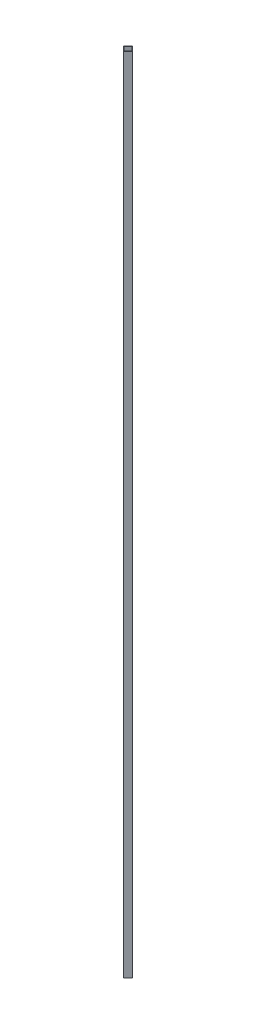
ISO-10303-21;
HEADER;
FILE_DESCRIPTION(('STEP AP214'),'2;1');
FILE_NAME('part.step','',(''),(''),'','','');
FILE_SCHEMA(('AUTOMOTIVE_DESIGN { 1 0 10303 214 1 1 1 1 }'));
ENDSEC;
DATA;
#1=APPLICATION_CONTEXT('core data for automotive mechanical design processes');
#2=APPLICATION_PROTOCOL_DEFINITION('international standard','automotive_design',2000,#1);
#3=PRODUCT_CONTEXT('',#1,'mechanical');
#4=PRODUCT('Part','Part','',(#3));
#5=PRODUCT_RELATED_PRODUCT_CATEGORY('part','',(#4));
#6=PRODUCT_DEFINITION_FORMATION('','',#4);
#7=PRODUCT_DEFINITION_CONTEXT('part definition',#1,'design');
#8=PRODUCT_DEFINITION('design','',#6,#7);
#9=PRODUCT_DEFINITION_SHAPE('','',#8);
#10=(LENGTH_UNIT() NAMED_UNIT(*) SI_UNIT(.MILLI.,.METRE.));
#11=(NAMED_UNIT(*) PLANE_ANGLE_UNIT() SI_UNIT($,.RADIAN.));
#12=(NAMED_UNIT(*) SI_UNIT($,.STERADIAN.) SOLID_ANGLE_UNIT());
#13=UNCERTAINTY_MEASURE_WITH_UNIT(LENGTH_MEASURE(1.E-05),#10,'distance_accuracy_value','');
#14=(GEOMETRIC_REPRESENTATION_CONTEXT(3) GLOBAL_UNCERTAINTY_ASSIGNED_CONTEXT((#13)) GLOBAL_UNIT_ASSIGNED_CONTEXT((#10,
#11,#12)) REPRESENTATION_CONTEXT('',''));
#15=CARTESIAN_POINT('',(0.,0.,0.));
#16=DIRECTION('',(0.,0.,1.));
#17=DIRECTION('',(1.,0.,0.));
#18=AXIS2_PLACEMENT_3D('',#15,#16,#17);
#19=CARTESIAN_POINT('',(-17.9605122421383,3048.,0.));
#20=DIRECTION('',(0.707106781186546,0.,-0.707106781186549));
#21=DIRECTION('',(-0.707106781186549,0.,-0.707106781186546));
#22=AXIS2_PLACEMENT_3D('',#19,#20,#21);
#23=PLANE('',#22);
#24=DIRECTION('',(0.707106781186549,0.,0.707106781186546));
#25=VECTOR('',#24,1.);
#26=CARTESIAN_POINT('',(-17.9605122421383,0.,0.));
#27=LINE('',#26,#25);
#28=CARTESIAN_POINT('',(-17.9605122421383,0.,0.));
#29=VERTEX_POINT('',#28);
#30=CARTESIAN_POINT('',(0.,0.,17.9605122421383));
#31=VERTEX_POINT('',#30);
#32=EDGE_CURVE('E160',#29,#31,#27,.T.);
#33=ORIENTED_EDGE('',*,*,#32,.T.);
#34=DIRECTION('',(0.,-1.,0.));
#35=VECTOR('',#34,1.);
#36=CARTESIAN_POINT('',(0.,3048.,17.9605122421383));
#37=LINE('',#36,#35);
#38=CARTESIAN_POINT('',(0.,3048.,17.9605122421383));
#39=VERTEX_POINT('',#38);
#40=EDGE_CURVE('E12',#39,#31,#37,.T.);
#41=ORIENTED_EDGE('',*,*,#40,.F.);
#42=DIRECTION('',(0.707106781186549,0.,0.707106781186546));
#43=VECTOR('',#42,1.);
#44=CARTESIAN_POINT('',(-17.9605122421383,3048.,0.));
#45=LINE('',#44,#43);
#46=CARTESIAN_POINT('',(-17.9605122421383,3048.,0.));
#47=VERTEX_POINT('',#46);
#48=EDGE_CURVE('E164',#47,#39,#45,.T.);
#49=ORIENTED_EDGE('',*,*,#48,.F.);
#50=DIRECTION('',(0.,-1.,0.));
#51=VECTOR('',#50,1.);
#52=CARTESIAN_POINT('',(-17.9605122421383,3048.,0.));
#53=LINE('',#52,#51);
#54=EDGE_CURVE('E176',#47,#29,#53,.T.);
#55=ORIENTED_EDGE('',*,*,#54,.T.);
#56=EDGE_LOOP('',(#33,#41,#49,#55));
#57=FACE_BOUND('',#56,.T.);
#58=ADVANCED_FACE('F65',(#57),#23,.F.);
#59=CARTESIAN_POINT('',(0.,3048.,17.9605122421383));
#60=DIRECTION('',(-0.707106781186549,0.,-0.707106781186546));
#61=DIRECTION('',(-0.707106781186546,0.,0.707106781186549));
#62=AXIS2_PLACEMENT_3D('',#59,#60,#61);
#63=PLANE('',#62);
#64=DIRECTION('',(0.707106781186546,0.,-0.707106781186549));
#65=VECTOR('',#64,1.);
#66=CARTESIAN_POINT('',(0.,0.,17.9605122421383));
#67=LINE('',#66,#65);
#68=CARTESIAN_POINT('',(17.9605122421383,0.,0.));
#69=VERTEX_POINT('',#68);
#70=EDGE_CURVE('E179',#31,#69,#67,.T.);
#71=ORIENTED_EDGE('',*,*,#70,.T.);
#72=DIRECTION('',(0.,-1.,0.));
#73=VECTOR('',#72,1.);
#74=CARTESIAN_POINT('',(17.9605122421383,3048.,0.));
#75=LINE('',#74,#73);
#76=CARTESIAN_POINT('',(17.9605122421383,3048.,0.));
#77=VERTEX_POINT('',#76);
#78=EDGE_CURVE('E72',#77,#69,#75,.T.);
#79=ORIENTED_EDGE('',*,*,#78,.F.);
#80=DIRECTION('',(0.707106781186546,0.,-0.707106781186549));
#81=VECTOR('',#80,1.);
#82=CARTESIAN_POINT('',(0.,3048.,17.9605122421383));
#83=LINE('',#82,#81);
#84=EDGE_CURVE('E167',#39,#77,#83,.T.);
#85=ORIENTED_EDGE('',*,*,#84,.F.);
#86=ORIENTED_EDGE('',*,*,#40,.T.);
#87=EDGE_LOOP('',(#71,#79,#85,#86));
#88=FACE_BOUND('',#87,.T.);
#89=ADVANCED_FACE('F195',(#88),#63,.F.);
#90=CARTESIAN_POINT('',(0.,3048.,-17.9605122421383));
#91=DIRECTION('',(0.707106781186546,0.,-0.707106781186549));
#92=DIRECTION('',(-0.707106781186549,0.,-0.707106781186546));
#93=AXIS2_PLACEMENT_3D('',#90,#91,#92);
#94=PLANE('',#93);
#95=DIRECTION('',(0.707106781186549,0.,0.707106781186546));
#96=VECTOR('',#95,1.);
#97=CARTESIAN_POINT('',(0.,0.,-17.9605122421383));
#98=LINE('',#97,#96);
#99=CARTESIAN_POINT('',(0.,0.,-17.9605122421383));
#100=VERTEX_POINT('',#99);
#101=EDGE_CURVE('E182',#100,#69,#98,.T.);
#102=ORIENTED_EDGE('',*,*,#101,.F.);
#103=DIRECTION('',(0.,-1.,0.));
#104=VECTOR('',#103,1.);
#105=CARTESIAN_POINT('',(0.,3048.,-17.9605122421383));
#106=LINE('',#105,#104);
#107=CARTESIAN_POINT('',(0.,3048.,-17.9605122421383));
#108=VERTEX_POINT('',#107);
#109=EDGE_CURVE('E188',#108,#100,#106,.T.);
#110=ORIENTED_EDGE('',*,*,#109,.F.);
#111=DIRECTION('',(0.707106781186549,0.,0.707106781186546));
#112=VECTOR('',#111,1.);
#113=CARTESIAN_POINT('',(0.,3048.,-17.9605122421383));
#114=LINE('',#113,#112);
#115=EDGE_CURVE('E170',#108,#77,#114,.T.);
#116=ORIENTED_EDGE('',*,*,#115,.T.);
#117=ORIENTED_EDGE('',*,*,#78,.T.);
#118=EDGE_LOOP('',(#102,#110,#116,#117));
#119=FACE_BOUND('',#118,.T.);
#120=ADVANCED_FACE('F192',(#119),#94,.T.);
#121=CARTESIAN_POINT('',(-17.9605122421383,3048.,0.));
#122=DIRECTION('',(-0.707106781186549,0.,-0.707106781186546));
#123=DIRECTION('',(-0.707106781186546,0.,0.707106781186549));
#124=AXIS2_PLACEMENT_3D('',#121,#122,#123);
#125=PLANE('',#124);
#126=DIRECTION('',(0.707106781186546,0.,-0.707106781186549));
#127=VECTOR('',#126,1.);
#128=CARTESIAN_POINT('',(-17.9605122421383,0.,0.));
#129=LINE('',#128,#127);
#130=EDGE_CURVE('E168',#29,#100,#129,.T.);
#131=ORIENTED_EDGE('',*,*,#130,.F.);
#132=ORIENTED_EDGE('',*,*,#54,.F.);
#133=DIRECTION('',(0.707106781186546,0.,-0.707106781186549));
#134=VECTOR('',#133,1.);
#135=CARTESIAN_POINT('',(-17.9605122421383,3048.,0.));
#136=LINE('',#135,#134);
#137=EDGE_CURVE('E173',#47,#108,#136,.T.);
#138=ORIENTED_EDGE('',*,*,#137,.T.);
#139=ORIENTED_EDGE('',*,*,#109,.T.);
#140=EDGE_LOOP('',(#131,#132,#138,#139));
#141=FACE_BOUND('',#140,.T.);
#142=ADVANCED_FACE('F202',(#141),#125,.T.);
#143=CARTESIAN_POINT('',(0.,3048.,0.));
#144=DIRECTION('',(0.,1.,0.));
#145=DIRECTION('',(0.,0.,1.));
#146=AXIS2_PLACEMENT_3D('',#143,#144,#145);
#147=PLANE('',#146);
#148=DIRECTION('',(-0.707106781186542,0.,-0.707106781186553));
#149=VECTOR('',#148,1.);
#150=CARTESIAN_POINT('',(-1.5880271430326E-13,3048.,15.6977705423414));
#151=LINE('',#150,#149);
#152=CARTESIAN_POINT('',(-1.5880271430326E-13,3048.,15.6977705423414));
#153=VERTEX_POINT('',#152);
#154=CARTESIAN_POINT('',(-15.6977705423413,3048.,0.));
#155=VERTEX_POINT('',#154);
#156=EDGE_CURVE('E131',#153,#155,#151,.T.);
#157=ORIENTED_EDGE('',*,*,#156,.T.);
#158=DIRECTION('',(0.707106781186546,0.,-0.70710678118655));
#159=VECTOR('',#158,1.);
#160=CARTESIAN_POINT('',(-15.6977705423413,3048.,0.));
#161=LINE('',#160,#159);
#162=CARTESIAN_POINT('',(0.,3048.,-15.6977705423414));
#163=VERTEX_POINT('',#162);
#164=EDGE_CURVE('E137',#155,#163,#161,.T.);
#165=ORIENTED_EDGE('',*,*,#164,.T.);
#166=DIRECTION('',(-0.70710678118654,0.,-0.707106781186555));
#167=VECTOR('',#166,1.);
#168=CARTESIAN_POINT('',(15.6977705423411,3048.,1.26104640115252E-13));
#169=LINE('',#168,#167);
#170=CARTESIAN_POINT('',(15.6977705423411,3048.,1.26104640115252E-13));
#171=VERTEX_POINT('',#170);
#172=EDGE_CURVE('E141',#171,#163,#169,.T.);
#173=ORIENTED_EDGE('',*,*,#172,.F.);
#174=DIRECTION('',(0.707106781186547,0.,-0.707106781186548));
#175=VECTOR('',#174,1.);
#176=CARTESIAN_POINT('',(-1.5880271430326E-13,3048.,15.6977705423414));
#177=LINE('',#176,#175);
#178=EDGE_CURVE('E134',#153,#171,#177,.T.);
#179=ORIENTED_EDGE('',*,*,#178,.F.);
#180=EDGE_LOOP('',(#157,#165,#173,#179));
#181=FACE_BOUND('',#180,.T.);
#182=ORIENTED_EDGE('',*,*,#48,.T.);
#183=ORIENTED_EDGE('',*,*,#84,.T.);
#184=ORIENTED_EDGE('',*,*,#115,.F.);
#185=ORIENTED_EDGE('',*,*,#137,.F.);
#186=EDGE_LOOP('',(#182,#183,#184,#185));
#187=FACE_BOUND('',#186,.T.);
#188=ADVANCED_FACE('F143',(#181,#187),#147,.T.);
#189=CARTESIAN_POINT('',(0.,0.,0.));
#190=DIRECTION('',(0.,1.,0.));
#191=DIRECTION('',(0.,0.,1.));
#192=AXIS2_PLACEMENT_3D('',#189,#190,#191);
#193=PLANE('',#192);
#194=DIRECTION('',(0.707106781186546,0.,-0.70710678118655));
#195=VECTOR('',#194,1.);
#196=CARTESIAN_POINT('',(-15.6977705423413,0.,0.));
#197=LINE('',#196,#195);
#198=CARTESIAN_POINT('',(-15.6977705423413,0.,0.));
#199=VERTEX_POINT('',#198);
#200=CARTESIAN_POINT('',(0.,0.,-15.6977705423414));
#201=VERTEX_POINT('',#200);
#202=EDGE_CURVE('E154',#199,#201,#197,.T.);
#203=ORIENTED_EDGE('',*,*,#202,.F.);
#204=DIRECTION('',(-0.707106781186542,0.,-0.707106781186553));
#205=VECTOR('',#204,1.);
#206=CARTESIAN_POINT('',(-1.5880271430326E-13,0.,15.6977705423414));
#207=LINE('',#206,#205);
#208=CARTESIAN_POINT('',(-1.5880271430326E-13,0.,15.6977705423414));
#209=VERTEX_POINT('',#208);
#210=EDGE_CURVE('E87',#209,#199,#207,.T.);
#211=ORIENTED_EDGE('',*,*,#210,.F.);
#212=DIRECTION('',(0.707106781186547,0.,-0.707106781186548));
#213=VECTOR('',#212,1.);
#214=CARTESIAN_POINT('',(-1.5880271430326E-13,0.,15.6977705423414));
#215=LINE('',#214,#213);
#216=CARTESIAN_POINT('',(15.6977705423411,0.,1.26104640115252E-13));
#217=VERTEX_POINT('',#216);
#218=EDGE_CURVE('E145',#209,#217,#215,.T.);
#219=ORIENTED_EDGE('',*,*,#218,.T.);
#220=DIRECTION('',(-0.70710678118654,0.,-0.707106781186555));
#221=VECTOR('',#220,1.);
#222=CARTESIAN_POINT('',(15.6977705423411,0.,1.26104640115252E-13));
#223=LINE('',#222,#221);
#224=EDGE_CURVE('E148',#217,#201,#223,.T.);
#225=ORIENTED_EDGE('',*,*,#224,.T.);
#226=EDGE_LOOP('',(#203,#211,#219,#225));
#227=FACE_BOUND('',#226,.T.);
#228=ORIENTED_EDGE('',*,*,#32,.F.);
#229=ORIENTED_EDGE('',*,*,#130,.T.);
#230=ORIENTED_EDGE('',*,*,#101,.T.);
#231=ORIENTED_EDGE('',*,*,#70,.F.);
#232=EDGE_LOOP('',(#228,#229,#230,#231));
#233=FACE_BOUND('',#232,.T.);
#234=ADVANCED_FACE('F199',(#227,#233),#193,.F.);
#235=CARTESIAN_POINT('',(-1.5880271430326E-13,3048.,15.6977705423414));
#236=DIRECTION('',(-0.707106781186553,0.,0.707106781186542));
#237=DIRECTION('',(0.707106781186542,0.,0.707106781186553));
#238=AXIS2_PLACEMENT_3D('',#235,#236,#237);
#239=PLANE('',#238);
#240=ORIENTED_EDGE('',*,*,#210,.T.);
#241=DIRECTION('',(0.,-1.,0.));
#242=VECTOR('',#241,1.);
#243=CARTESIAN_POINT('',(-15.6977705423413,3048.,0.));
#244=LINE('',#243,#242);
#245=EDGE_CURVE('E128',#155,#199,#244,.T.);
#246=ORIENTED_EDGE('',*,*,#245,.F.);
#247=ORIENTED_EDGE('',*,*,#156,.F.);
#248=DIRECTION('',(0.,-1.,0.));
#249=VECTOR('',#248,1.);
#250=CARTESIAN_POINT('',(-1.5880271430326E-13,3048.,15.6977705423414));
#251=LINE('',#250,#249);
#252=EDGE_CURVE('E158',#153,#209,#251,.T.);
#253=ORIENTED_EDGE('',*,*,#252,.T.);
#254=EDGE_LOOP('',(#240,#246,#247,#253));
#255=FACE_BOUND('',#254,.T.);
#256=ADVANCED_FACE('F129',(#255),#239,.F.);
#257=CARTESIAN_POINT('',(-1.5880271430326E-13,3048.,15.6977705423414));
#258=DIRECTION('',(-0.707106781186548,0.,-0.707106781186547));
#259=DIRECTION('',(-0.707106781186547,0.,0.707106781186548));
#260=AXIS2_PLACEMENT_3D('',#257,#258,#259);
#261=PLANE('',#260);
#262=ORIENTED_EDGE('',*,*,#218,.F.);
#263=ORIENTED_EDGE('',*,*,#252,.F.);
#264=ORIENTED_EDGE('',*,*,#178,.T.);
#265=DIRECTION('',(0.,-1.,0.));
#266=VECTOR('',#265,1.);
#267=CARTESIAN_POINT('',(15.6977705423411,3048.,1.26104640115252E-13));
#268=LINE('',#267,#266);
#269=EDGE_CURVE('E161',#171,#217,#268,.T.);
#270=ORIENTED_EDGE('',*,*,#269,.T.);
#271=EDGE_LOOP('',(#262,#263,#264,#270));
#272=FACE_BOUND('',#271,.T.);
#273=ADVANCED_FACE('F224',(#272),#261,.T.);
#274=CARTESIAN_POINT('',(15.6977705423411,3048.,1.26104640115252E-13));
#275=DIRECTION('',(-0.707106781186555,0.,0.70710678118654));
#276=DIRECTION('',(0.70710678118654,0.,0.707106781186555));
#277=AXIS2_PLACEMENT_3D('',#274,#275,#276);
#278=PLANE('',#277);
#279=ORIENTED_EDGE('',*,*,#224,.F.);
#280=ORIENTED_EDGE('',*,*,#269,.F.);
#281=ORIENTED_EDGE('',*,*,#172,.T.);
#282=DIRECTION('',(0.,-1.,0.));
#283=VECTOR('',#282,1.);
#284=CARTESIAN_POINT('',(0.,3048.,-15.6977705423414));
#285=LINE('',#284,#283);
#286=EDGE_CURVE('E79',#163,#201,#285,.T.);
#287=ORIENTED_EDGE('',*,*,#286,.T.);
#288=EDGE_LOOP('',(#279,#280,#281,#287));
#289=FACE_BOUND('',#288,.T.);
#290=ADVANCED_FACE('F227',(#289),#278,.T.);
#291=CARTESIAN_POINT('',(-15.6977705423413,3048.,0.));
#292=DIRECTION('',(-0.70710678118655,0.,-0.707106781186545));
#293=DIRECTION('',(-0.707106781186545,0.,0.70710678118655));
#294=AXIS2_PLACEMENT_3D('',#291,#292,#293);
#295=PLANE('',#294);
#296=ORIENTED_EDGE('',*,*,#202,.T.);
#297=ORIENTED_EDGE('',*,*,#286,.F.);
#298=ORIENTED_EDGE('',*,*,#164,.F.);
#299=ORIENTED_EDGE('',*,*,#245,.T.);
#300=EDGE_LOOP('',(#296,#297,#298,#299));
#301=FACE_BOUND('',#300,.T.);
#302=ADVANCED_FACE('F138',(#301),#295,.F.);
#303=CLOSED_SHELL('',(#58,#89,#120,#142,#188,#234,#256,#273,#290,#302));
#304=MANIFOLD_SOLID_BREP('B2',#303);
#305=ADVANCED_BREP_SHAPE_REPRESENTATION('',(#18,#304),#14);
#306=SHAPE_DEFINITION_REPRESENTATION(#9,#305);
ENDSEC;
END-ISO-10303-21;
